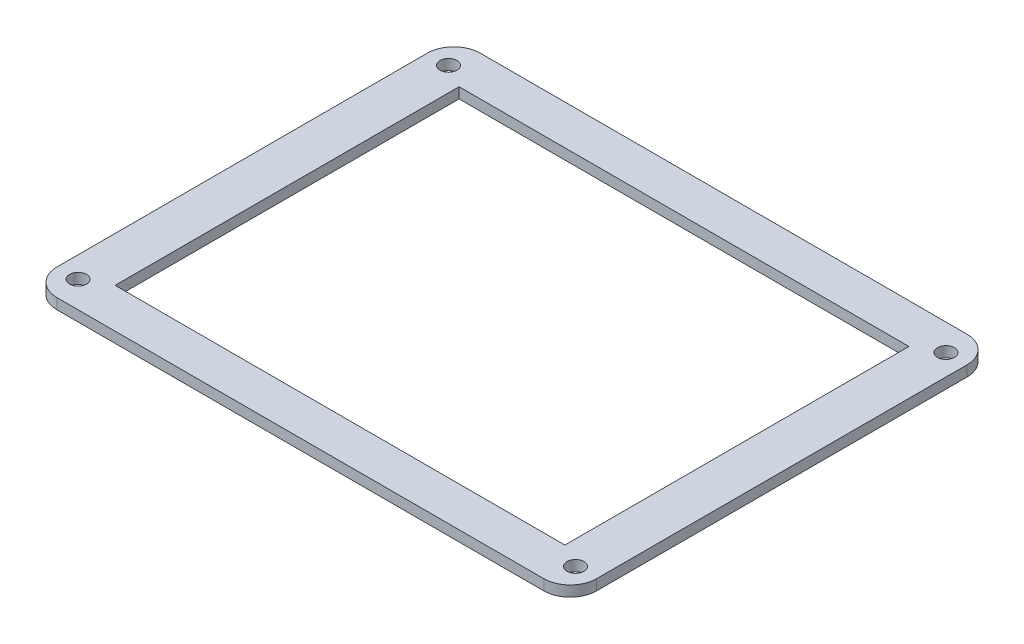
ISO-10303-21;
HEADER;
FILE_DESCRIPTION(('STEP AP214'),'2;1');
FILE_NAME('part.step','',(''),(''),'','','');
FILE_SCHEMA(('AUTOMOTIVE_DESIGN { 1 0 10303 214 1 1 1 1 }'));
ENDSEC;
DATA;
#1=APPLICATION_CONTEXT('core data for automotive mechanical design processes');
#2=APPLICATION_PROTOCOL_DEFINITION('international standard','automotive_design',2000,#1);
#3=PRODUCT_CONTEXT('',#1,'mechanical');
#4=PRODUCT('Part','Part','',(#3));
#5=PRODUCT_RELATED_PRODUCT_CATEGORY('part','',(#4));
#6=PRODUCT_DEFINITION_FORMATION('','',#4);
#7=PRODUCT_DEFINITION_CONTEXT('part definition',#1,'design');
#8=PRODUCT_DEFINITION('design','',#6,#7);
#9=PRODUCT_DEFINITION_SHAPE('','',#8);
#10=(LENGTH_UNIT() NAMED_UNIT(*) SI_UNIT(.MILLI.,.METRE.));
#11=(NAMED_UNIT(*) PLANE_ANGLE_UNIT() SI_UNIT($,.RADIAN.));
#12=(NAMED_UNIT(*) SI_UNIT($,.STERADIAN.) SOLID_ANGLE_UNIT());
#13=UNCERTAINTY_MEASURE_WITH_UNIT(LENGTH_MEASURE(1.E-05),#10,'distance_accuracy_value','');
#14=(GEOMETRIC_REPRESENTATION_CONTEXT(3) GLOBAL_UNCERTAINTY_ASSIGNED_CONTEXT((#13)) GLOBAL_UNIT_ASSIGNED_CONTEXT((#10,
#11,#12)) REPRESENTATION_CONTEXT('',''));
#15=CARTESIAN_POINT('',(0.,0.,0.));
#16=DIRECTION('',(0.,0.,1.));
#17=DIRECTION('',(1.,0.,0.));
#18=AXIS2_PLACEMENT_3D('',#15,#16,#17);
#19=CARTESIAN_POINT('',(0.,2.,0.));
#20=DIRECTION('',(0.,-1.,0.));
#21=DIRECTION('',(0.,0.,-1.));
#22=AXIS2_PLACEMENT_3D('',#19,#20,#21);
#23=PLANE('',#22);
#24=CARTESIAN_POINT('',(-47.,2.,-35.));
#25=DIRECTION('',(0.,-1.,0.));
#26=DIRECTION('',(0.,0.,-1.));
#27=AXIS2_PLACEMENT_3D('',#24,#25,#26);
#28=CIRCLE('',#27,1.6);
#29=CARTESIAN_POINT('',(-47.,2.,-36.6));
#30=VERTEX_POINT('',#29);
#31=EDGE_CURVE('E198',#30,#30,#28,.T.);
#32=ORIENTED_EDGE('',*,*,#31,.T.);
#33=EDGE_LOOP('',(#32));
#34=FACE_BOUND('',#33,.T.);
#35=CARTESIAN_POINT('',(47.,2.,-35.));
#36=DIRECTION('',(0.,-1.,0.));
#37=DIRECTION('',(0.,0.,-1.));
#38=AXIS2_PLACEMENT_3D('',#35,#36,#37);
#39=CIRCLE('',#38,1.6);
#40=CARTESIAN_POINT('',(47.,2.,-36.6));
#41=VERTEX_POINT('',#40);
#42=EDGE_CURVE('E302',#41,#41,#39,.T.);
#43=ORIENTED_EDGE('',*,*,#42,.T.);
#44=EDGE_LOOP('',(#43));
#45=FACE_BOUND('',#44,.T.);
#46=CARTESIAN_POINT('',(47.,2.,35.));
#47=DIRECTION('',(0.,-1.,0.));
#48=DIRECTION('',(0.,0.,-1.));
#49=AXIS2_PLACEMENT_3D('',#46,#47,#48);
#50=CIRCLE('',#49,1.6);
#51=CARTESIAN_POINT('',(47.,2.,33.4));
#52=VERTEX_POINT('',#51);
#53=EDGE_CURVE('E298',#52,#52,#50,.T.);
#54=ORIENTED_EDGE('',*,*,#53,.T.);
#55=EDGE_LOOP('',(#54));
#56=FACE_BOUND('',#55,.T.);
#57=CARTESIAN_POINT('',(-47.,2.,35.));
#58=DIRECTION('',(0.,-1.,0.));
#59=DIRECTION('',(0.,0.,-1.));
#60=AXIS2_PLACEMENT_3D('',#57,#58,#59);
#61=CIRCLE('',#60,1.6);
#62=CARTESIAN_POINT('',(-47.,2.,33.4));
#63=VERTEX_POINT('',#62);
#64=EDGE_CURVE('E294',#63,#63,#61,.T.);
#65=ORIENTED_EDGE('',*,*,#64,.T.);
#66=EDGE_LOOP('',(#65));
#67=FACE_BOUND('',#66,.T.);
#68=DIRECTION('',(1.,0.,0.));
#69=VECTOR('',#68,1.);
#70=CARTESIAN_POINT('',(-51.,2.,-40.));
#71=LINE('',#70,#69);
#72=CARTESIAN_POINT('',(-46.,2.,-40.));
#73=VERTEX_POINT('',#72);
#74=CARTESIAN_POINT('',(46.,2.,-40.));
#75=VERTEX_POINT('',#74);
#76=EDGE_CURVE('E222',#73,#75,#71,.T.);
#77=ORIENTED_EDGE('',*,*,#76,.F.);
#78=CARTESIAN_POINT('',(-46.,2.,-35.));
#79=DIRECTION('',(0.,-1.,0.));
#80=DIRECTION('',(0.,0.,-1.));
#81=AXIS2_PLACEMENT_3D('',#78,#79,#80);
#82=CIRCLE('',#81,5.);
#83=CARTESIAN_POINT('',(-51.,2.,-35.));
#84=VERTEX_POINT('',#83);
#85=EDGE_CURVE('E278',#73,#84,#82,.F.);
#86=ORIENTED_EDGE('',*,*,#85,.T.);
#87=DIRECTION('',(0.,0.,1.));
#88=VECTOR('',#87,1.);
#89=CARTESIAN_POINT('',(-51.,2.,-40.));
#90=LINE('',#89,#88);
#91=CARTESIAN_POINT('',(-51.,2.,35.));
#92=VERTEX_POINT('',#91);
#93=EDGE_CURVE('E226',#84,#92,#90,.T.);
#94=ORIENTED_EDGE('',*,*,#93,.T.);
#95=CARTESIAN_POINT('',(-46.,2.,35.));
#96=DIRECTION('',(0.,-1.,0.));
#97=DIRECTION('',(0.,0.,-1.));
#98=AXIS2_PLACEMENT_3D('',#95,#96,#97);
#99=CIRCLE('',#98,5.);
#100=CARTESIAN_POINT('',(-46.,2.,40.));
#101=VERTEX_POINT('',#100);
#102=EDGE_CURVE('E275',#92,#101,#99,.F.);
#103=ORIENTED_EDGE('',*,*,#102,.T.);
#104=DIRECTION('',(1.,0.,0.));
#105=VECTOR('',#104,1.);
#106=CARTESIAN_POINT('',(-51.,2.,40.));
#107=LINE('',#106,#105);
#108=CARTESIAN_POINT('',(46.,2.,40.));
#109=VERTEX_POINT('',#108);
#110=EDGE_CURVE('E215',#101,#109,#107,.T.);
#111=ORIENTED_EDGE('',*,*,#110,.T.);
#112=CARTESIAN_POINT('',(46.,2.,35.));
#113=DIRECTION('',(0.,-1.,0.));
#114=DIRECTION('',(0.,0.,-1.));
#115=AXIS2_PLACEMENT_3D('',#112,#113,#114);
#116=CIRCLE('',#115,5.);
#117=CARTESIAN_POINT('',(51.,2.,35.));
#118=VERTEX_POINT('',#117);
#119=EDGE_CURVE('E85',#109,#118,#116,.F.);
#120=ORIENTED_EDGE('',*,*,#119,.T.);
#121=DIRECTION('',(0.,0.,1.));
#122=VECTOR('',#121,1.);
#123=CARTESIAN_POINT('',(51.,2.,-40.));
#124=LINE('',#123,#122);
#125=CARTESIAN_POINT('',(51.,2.,-35.));
#126=VERTEX_POINT('',#125);
#127=EDGE_CURVE('E218',#126,#118,#124,.T.);
#128=ORIENTED_EDGE('',*,*,#127,.F.);
#129=CARTESIAN_POINT('',(46.,2.,-35.));
#130=DIRECTION('',(0.,-1.,0.));
#131=DIRECTION('',(0.,0.,-1.));
#132=AXIS2_PLACEMENT_3D('',#129,#130,#131);
#133=CIRCLE('',#132,5.);
#134=EDGE_CURVE('E270',#126,#75,#133,.F.);
#135=ORIENTED_EDGE('',*,*,#134,.T.);
#136=EDGE_LOOP('',(#77,#86,#94,#103,#111,#120,#128,#135));
#137=FACE_BOUND('',#136,.T.);
#138=DIRECTION('',(1.,0.,0.));
#139=VECTOR('',#138,1.);
#140=CARTESIAN_POINT('',(-42.5,2.,32.5));
#141=LINE('',#140,#139);
#142=CARTESIAN_POINT('',(-42.5,2.,32.5));
#143=VERTEX_POINT('',#142);
#144=CARTESIAN_POINT('',(42.5,2.,32.5));
#145=VERTEX_POINT('',#144);
#146=EDGE_CURVE('E160',#143,#145,#141,.T.);
#147=ORIENTED_EDGE('',*,*,#146,.F.);
#148=DIRECTION('',(0.,0.,1.));
#149=VECTOR('',#148,1.);
#150=CARTESIAN_POINT('',(-42.5,2.,-32.5));
#151=LINE('',#150,#149);
#152=CARTESIAN_POINT('',(-42.5,2.,-32.5));
#153=VERTEX_POINT('',#152);
#154=EDGE_CURVE('E189',#153,#143,#151,.T.);
#155=ORIENTED_EDGE('',*,*,#154,.F.);
#156=DIRECTION('',(1.,0.,0.));
#157=VECTOR('',#156,1.);
#158=CARTESIAN_POINT('',(-42.5,2.,-32.5));
#159=LINE('',#158,#157);
#160=CARTESIAN_POINT('',(42.5,2.,-32.5));
#161=VERTEX_POINT('',#160);
#162=EDGE_CURVE('E185',#153,#161,#159,.T.);
#163=ORIENTED_EDGE('',*,*,#162,.T.);
#164=DIRECTION('',(0.,0.,1.));
#165=VECTOR('',#164,1.);
#166=CARTESIAN_POINT('',(42.5,2.,-32.5));
#167=LINE('',#166,#165);
#168=EDGE_CURVE('E171',#161,#145,#167,.T.);
#169=ORIENTED_EDGE('',*,*,#168,.T.);
#170=EDGE_LOOP('',(#147,#155,#163,#169));
#171=FACE_BOUND('',#170,.T.);
#172=ADVANCED_FACE('F67',(#34,#45,#56,#67,#137,#171),#23,.F.);
#173=CARTESIAN_POINT('',(0.,0.,0.));
#174=DIRECTION('',(0.,-1.,0.));
#175=DIRECTION('',(0.,0.,-1.));
#176=AXIS2_PLACEMENT_3D('',#173,#174,#175);
#177=PLANE('',#176);
#178=CARTESIAN_POINT('',(-47.,0.,-35.));
#179=DIRECTION('',(0.,-1.,0.));
#180=DIRECTION('',(0.,0.,-1.));
#181=AXIS2_PLACEMENT_3D('',#178,#179,#180);
#182=CIRCLE('',#181,1.6);
#183=CARTESIAN_POINT('',(-47.,0.,-36.6));
#184=VERTEX_POINT('',#183);
#185=EDGE_CURVE('E71',#184,#184,#182,.T.);
#186=ORIENTED_EDGE('',*,*,#185,.F.);
#187=EDGE_LOOP('',(#186));
#188=FACE_BOUND('',#187,.T.);
#189=CARTESIAN_POINT('',(47.,0.,-35.));
#190=DIRECTION('',(0.,-1.,0.));
#191=DIRECTION('',(0.,0.,-1.));
#192=AXIS2_PLACEMENT_3D('',#189,#190,#191);
#193=CIRCLE('',#192,1.6);
#194=CARTESIAN_POINT('',(47.,0.,-36.6));
#195=VERTEX_POINT('',#194);
#196=EDGE_CURVE('E299',#195,#195,#193,.T.);
#197=ORIENTED_EDGE('',*,*,#196,.F.);
#198=EDGE_LOOP('',(#197));
#199=FACE_BOUND('',#198,.T.);
#200=CARTESIAN_POINT('',(47.,0.,35.));
#201=DIRECTION('',(0.,-1.,0.));
#202=DIRECTION('',(0.,0.,-1.));
#203=AXIS2_PLACEMENT_3D('',#200,#201,#202);
#204=CIRCLE('',#203,1.6);
#205=CARTESIAN_POINT('',(47.,0.,33.4));
#206=VERTEX_POINT('',#205);
#207=EDGE_CURVE('E295',#206,#206,#204,.T.);
#208=ORIENTED_EDGE('',*,*,#207,.F.);
#209=EDGE_LOOP('',(#208));
#210=FACE_BOUND('',#209,.T.);
#211=CARTESIAN_POINT('',(-47.,0.,35.));
#212=DIRECTION('',(0.,-1.,0.));
#213=DIRECTION('',(0.,0.,-1.));
#214=AXIS2_PLACEMENT_3D('',#211,#212,#213);
#215=CIRCLE('',#214,1.6);
#216=CARTESIAN_POINT('',(-47.,0.,33.4));
#217=VERTEX_POINT('',#216);
#218=EDGE_CURVE('E290',#217,#217,#215,.T.);
#219=ORIENTED_EDGE('',*,*,#218,.F.);
#220=EDGE_LOOP('',(#219));
#221=FACE_BOUND('',#220,.T.);
#222=DIRECTION('',(0.,0.,1.));
#223=VECTOR('',#222,1.);
#224=CARTESIAN_POINT('',(-51.,0.,-40.));
#225=LINE('',#224,#223);
#226=CARTESIAN_POINT('',(-51.,0.,-35.));
#227=VERTEX_POINT('',#226);
#228=CARTESIAN_POINT('',(-51.,0.,35.));
#229=VERTEX_POINT('',#228);
#230=EDGE_CURVE('E219',#227,#229,#225,.T.);
#231=ORIENTED_EDGE('',*,*,#230,.F.);
#232=CARTESIAN_POINT('',(-46.,0.,-35.));
#233=DIRECTION('',(0.,-1.,0.));
#234=DIRECTION('',(0.,0.,-1.));
#235=AXIS2_PLACEMENT_3D('',#232,#233,#234);
#236=CIRCLE('',#235,5.);
#237=CARTESIAN_POINT('',(-46.,0.,-40.));
#238=VERTEX_POINT('',#237);
#239=EDGE_CURVE('E260',#227,#238,#236,.T.);
#240=ORIENTED_EDGE('',*,*,#239,.T.);
#241=DIRECTION('',(1.,0.,0.));
#242=VECTOR('',#241,1.);
#243=CARTESIAN_POINT('',(-51.,0.,-40.));
#244=LINE('',#243,#242);
#245=CARTESIAN_POINT('',(46.,0.,-40.));
#246=VERTEX_POINT('',#245);
#247=EDGE_CURVE('E238',#238,#246,#244,.T.);
#248=ORIENTED_EDGE('',*,*,#247,.T.);
#249=CARTESIAN_POINT('',(46.,0.,-35.));
#250=DIRECTION('',(0.,-1.,0.));
#251=DIRECTION('',(0.,0.,-1.));
#252=AXIS2_PLACEMENT_3D('',#249,#250,#251);
#253=CIRCLE('',#252,5.);
#254=CARTESIAN_POINT('',(51.,0.,-35.));
#255=VERTEX_POINT('',#254);
#256=EDGE_CURVE('E251',#246,#255,#253,.T.);
#257=ORIENTED_EDGE('',*,*,#256,.T.);
#258=DIRECTION('',(0.,0.,1.));
#259=VECTOR('',#258,1.);
#260=CARTESIAN_POINT('',(51.,0.,-40.));
#261=LINE('',#260,#259);
#262=CARTESIAN_POINT('',(51.,0.,35.));
#263=VERTEX_POINT('',#262);
#264=EDGE_CURVE('E234',#255,#263,#261,.T.);
#265=ORIENTED_EDGE('',*,*,#264,.T.);
#266=CARTESIAN_POINT('',(46.,0.,35.));
#267=DIRECTION('',(0.,-1.,0.));
#268=DIRECTION('',(0.,0.,-1.));
#269=AXIS2_PLACEMENT_3D('',#266,#267,#268);
#270=CIRCLE('',#269,5.);
#271=CARTESIAN_POINT('',(46.,0.,40.));
#272=VERTEX_POINT('',#271);
#273=EDGE_CURVE('E254',#263,#272,#270,.T.);
#274=ORIENTED_EDGE('',*,*,#273,.T.);
#275=DIRECTION('',(1.,0.,0.));
#276=VECTOR('',#275,1.);
#277=CARTESIAN_POINT('',(-51.,0.,40.));
#278=LINE('',#277,#276);
#279=CARTESIAN_POINT('',(-46.,0.,40.));
#280=VERTEX_POINT('',#279);
#281=EDGE_CURVE('E182',#280,#272,#278,.T.);
#282=ORIENTED_EDGE('',*,*,#281,.F.);
#283=CARTESIAN_POINT('',(-46.,0.,35.));
#284=DIRECTION('',(0.,-1.,0.));
#285=DIRECTION('',(0.,0.,-1.));
#286=AXIS2_PLACEMENT_3D('',#283,#284,#285);
#287=CIRCLE('',#286,5.);
#288=EDGE_CURVE('E257',#280,#229,#287,.T.);
#289=ORIENTED_EDGE('',*,*,#288,.T.);
#290=EDGE_LOOP('',(#231,#240,#248,#257,#265,#274,#282,#289));
#291=FACE_BOUND('',#290,.T.);
#292=DIRECTION('',(0.,0.,1.));
#293=VECTOR('',#292,1.);
#294=CARTESIAN_POINT('',(-42.5,0.,-32.5));
#295=LINE('',#294,#293);
#296=CARTESIAN_POINT('',(-42.5,0.,-32.5));
#297=VERTEX_POINT('',#296);
#298=CARTESIAN_POINT('',(-42.5,0.,32.5));
#299=VERTEX_POINT('',#298);
#300=EDGE_CURVE('E172',#297,#299,#295,.T.);
#301=ORIENTED_EDGE('',*,*,#300,.T.);
#302=DIRECTION('',(1.,0.,0.));
#303=VECTOR('',#302,1.);
#304=CARTESIAN_POINT('',(-42.5,0.,32.5));
#305=LINE('',#304,#303);
#306=CARTESIAN_POINT('',(42.5,0.,32.5));
#307=VERTEX_POINT('',#306);
#308=EDGE_CURVE('E195',#299,#307,#305,.T.);
#309=ORIENTED_EDGE('',*,*,#308,.T.);
#310=DIRECTION('',(0.,0.,1.));
#311=VECTOR('',#310,1.);
#312=CARTESIAN_POINT('',(42.5,0.,-32.5));
#313=LINE('',#312,#311);
#314=CARTESIAN_POINT('',(42.5,0.,-32.5));
#315=VERTEX_POINT('',#314);
#316=EDGE_CURVE('E179',#315,#307,#313,.T.);
#317=ORIENTED_EDGE('',*,*,#316,.F.);
#318=DIRECTION('',(1.,0.,0.));
#319=VECTOR('',#318,1.);
#320=CARTESIAN_POINT('',(-42.5,0.,-32.5));
#321=LINE('',#320,#319);
#322=EDGE_CURVE('E201',#297,#315,#321,.T.);
#323=ORIENTED_EDGE('',*,*,#322,.F.);
#324=EDGE_LOOP('',(#301,#309,#317,#323));
#325=FACE_BOUND('',#324,.T.);
#326=ADVANCED_FACE('F325',(#188,#199,#210,#221,#291,#325),#177,.T.);
#327=CARTESIAN_POINT('',(-51.,2.,40.));
#328=DIRECTION('',(0.,0.,-1.));
#329=DIRECTION('',(-1.,0.,0.));
#330=AXIS2_PLACEMENT_3D('',#327,#328,#329);
#331=PLANE('',#330);
#332=ORIENTED_EDGE('',*,*,#110,.F.);
#333=DIRECTION('',(0.,-1.,0.));
#334=VECTOR('',#333,1.);
#335=CARTESIAN_POINT('',(-46.,2.,40.));
#336=LINE('',#335,#334);
#337=EDGE_CURVE('E284',#101,#280,#336,.T.);
#338=ORIENTED_EDGE('',*,*,#337,.T.);
#339=ORIENTED_EDGE('',*,*,#281,.T.);
#340=DIRECTION('',(0.,-1.,0.));
#341=VECTOR('',#340,1.);
#342=CARTESIAN_POINT('',(46.,2.,40.));
#343=LINE('',#342,#341);
#344=EDGE_CURVE('E281',#272,#109,#343,.F.);
#345=ORIENTED_EDGE('',*,*,#344,.T.);
#346=EDGE_LOOP('',(#332,#338,#339,#345));
#347=FACE_BOUND('',#346,.T.);
#348=ADVANCED_FACE('F328',(#347),#331,.F.);
#349=CARTESIAN_POINT('',(51.,2.,-40.));
#350=DIRECTION('',(1.,0.,0.));
#351=DIRECTION('',(0.,0.,-1.));
#352=AXIS2_PLACEMENT_3D('',#349,#350,#351);
#353=PLANE('',#352);
#354=ORIENTED_EDGE('',*,*,#127,.T.);
#355=DIRECTION('',(0.,-1.,0.));
#356=VECTOR('',#355,1.);
#357=CARTESIAN_POINT('',(51.,0.,35.));
#358=LINE('',#357,#356);
#359=EDGE_CURVE('E12',#118,#263,#358,.T.);
#360=ORIENTED_EDGE('',*,*,#359,.T.);
#361=ORIENTED_EDGE('',*,*,#264,.F.);
#362=DIRECTION('',(0.,-1.,0.));
#363=VECTOR('',#362,1.);
#364=CARTESIAN_POINT('',(51.,2.,-35.));
#365=LINE('',#364,#363);
#366=EDGE_CURVE('E77',#255,#126,#365,.F.);
#367=ORIENTED_EDGE('',*,*,#366,.T.);
#368=EDGE_LOOP('',(#354,#360,#361,#367));
#369=FACE_BOUND('',#368,.T.);
#370=ADVANCED_FACE('F367',(#369),#353,.T.);
#371=CARTESIAN_POINT('',(-51.,2.,-40.));
#372=DIRECTION('',(0.,0.,-1.));
#373=DIRECTION('',(-1.,0.,0.));
#374=AXIS2_PLACEMENT_3D('',#371,#372,#373);
#375=PLANE('',#374);
#376=ORIENTED_EDGE('',*,*,#247,.F.);
#377=DIRECTION('',(0.,-1.,0.));
#378=VECTOR('',#377,1.);
#379=CARTESIAN_POINT('',(-46.,2.,-40.));
#380=LINE('',#379,#378);
#381=EDGE_CURVE('E267',#238,#73,#380,.F.);
#382=ORIENTED_EDGE('',*,*,#381,.T.);
#383=ORIENTED_EDGE('',*,*,#76,.T.);
#384=DIRECTION('',(0.,-1.,0.));
#385=VECTOR('',#384,1.);
#386=CARTESIAN_POINT('',(46.,2.,-40.));
#387=LINE('',#386,#385);
#388=EDGE_CURVE('E263',#75,#246,#387,.T.);
#389=ORIENTED_EDGE('',*,*,#388,.T.);
#390=EDGE_LOOP('',(#376,#382,#383,#389));
#391=FACE_BOUND('',#390,.T.);
#392=ADVANCED_FACE('F363',(#391),#375,.T.);
#393=CARTESIAN_POINT('',(-51.,2.,-40.));
#394=DIRECTION('',(1.,0.,0.));
#395=DIRECTION('',(0.,0.,-1.));
#396=AXIS2_PLACEMENT_3D('',#393,#394,#395);
#397=PLANE('',#396);
#398=ORIENTED_EDGE('',*,*,#93,.F.);
#399=DIRECTION('',(0.,-1.,0.));
#400=VECTOR('',#399,1.);
#401=CARTESIAN_POINT('',(-51.,0.,-35.));
#402=LINE('',#401,#400);
#403=EDGE_CURVE('E247',#84,#227,#402,.T.);
#404=ORIENTED_EDGE('',*,*,#403,.T.);
#405=ORIENTED_EDGE('',*,*,#230,.T.);
#406=DIRECTION('',(0.,-1.,0.));
#407=VECTOR('',#406,1.);
#408=CARTESIAN_POINT('',(-51.,2.,35.));
#409=LINE('',#408,#407);
#410=EDGE_CURVE('E230',#229,#92,#409,.F.);
#411=ORIENTED_EDGE('',*,*,#410,.T.);
#412=EDGE_LOOP('',(#398,#404,#405,#411));
#413=FACE_BOUND('',#412,.T.);
#414=ADVANCED_FACE('F360',(#413),#397,.F.);
#415=CARTESIAN_POINT('',(-42.5,2.,32.5));
#416=DIRECTION('',(0.,0.,-1.));
#417=DIRECTION('',(-1.,0.,0.));
#418=AXIS2_PLACEMENT_3D('',#415,#416,#417);
#419=PLANE('',#418);
#420=ORIENTED_EDGE('',*,*,#308,.F.);
#421=DIRECTION('',(0.,-1.,0.));
#422=VECTOR('',#421,1.);
#423=CARTESIAN_POINT('',(-42.5,2.,32.5));
#424=LINE('',#423,#422);
#425=EDGE_CURVE('E166',#143,#299,#424,.T.);
#426=ORIENTED_EDGE('',*,*,#425,.F.);
#427=ORIENTED_EDGE('',*,*,#146,.T.);
#428=DIRECTION('',(0.,-1.,0.));
#429=VECTOR('',#428,1.);
#430=CARTESIAN_POINT('',(42.5,2.,32.5));
#431=LINE('',#430,#429);
#432=EDGE_CURVE('E163',#145,#307,#431,.T.);
#433=ORIENTED_EDGE('',*,*,#432,.T.);
#434=EDGE_LOOP('',(#420,#426,#427,#433));
#435=FACE_BOUND('',#434,.T.);
#436=ADVANCED_FACE('F162',(#435),#419,.T.);
#437=CARTESIAN_POINT('',(42.5,2.,-32.5));
#438=DIRECTION('',(1.,0.,0.));
#439=DIRECTION('',(0.,0.,-1.));
#440=AXIS2_PLACEMENT_3D('',#437,#438,#439);
#441=PLANE('',#440);
#442=ORIENTED_EDGE('',*,*,#316,.T.);
#443=ORIENTED_EDGE('',*,*,#432,.F.);
#444=ORIENTED_EDGE('',*,*,#168,.F.);
#445=DIRECTION('',(0.,-1.,0.));
#446=VECTOR('',#445,1.);
#447=CARTESIAN_POINT('',(42.5,2.,-32.5));
#448=LINE('',#447,#446);
#449=EDGE_CURVE('E183',#161,#315,#448,.T.);
#450=ORIENTED_EDGE('',*,*,#449,.T.);
#451=EDGE_LOOP('',(#442,#443,#444,#450));
#452=FACE_BOUND('',#451,.T.);
#453=ADVANCED_FACE('F176',(#452),#441,.F.);
#454=CARTESIAN_POINT('',(-42.5,2.,-32.5));
#455=DIRECTION('',(0.,0.,-1.));
#456=DIRECTION('',(-1.,0.,0.));
#457=AXIS2_PLACEMENT_3D('',#454,#455,#456);
#458=PLANE('',#457);
#459=ORIENTED_EDGE('',*,*,#322,.T.);
#460=ORIENTED_EDGE('',*,*,#449,.F.);
#461=ORIENTED_EDGE('',*,*,#162,.F.);
#462=DIRECTION('',(0.,-1.,0.));
#463=VECTOR('',#462,1.);
#464=CARTESIAN_POINT('',(-42.5,2.,-32.5));
#465=LINE('',#464,#463);
#466=EDGE_CURVE('E210',#153,#297,#465,.T.);
#467=ORIENTED_EDGE('',*,*,#466,.T.);
#468=EDGE_LOOP('',(#459,#460,#461,#467));
#469=FACE_BOUND('',#468,.T.);
#470=ADVANCED_FACE('F343',(#469),#458,.F.);
#471=CARTESIAN_POINT('',(-42.5,2.,-32.5));
#472=DIRECTION('',(1.,0.,0.));
#473=DIRECTION('',(0.,0.,-1.));
#474=AXIS2_PLACEMENT_3D('',#471,#472,#473);
#475=PLANE('',#474);
#476=ORIENTED_EDGE('',*,*,#300,.F.);
#477=ORIENTED_EDGE('',*,*,#466,.F.);
#478=ORIENTED_EDGE('',*,*,#154,.T.);
#479=ORIENTED_EDGE('',*,*,#425,.T.);
#480=EDGE_LOOP('',(#476,#477,#478,#479));
#481=FACE_BOUND('',#480,.T.);
#482=ADVANCED_FACE('F341',(#481),#475,.T.);
#483=CARTESIAN_POINT('',(-46.,2.,-35.));
#484=DIRECTION('',(0.,1.,0.));
#485=DIRECTION('',(0.,0.,1.));
#486=AXIS2_PLACEMENT_3D('',#483,#484,#485);
#487=CYLINDRICAL_SURFACE('',#486,5.);
#488=ORIENTED_EDGE('',*,*,#85,.F.);
#489=ORIENTED_EDGE('',*,*,#381,.F.);
#490=ORIENTED_EDGE('',*,*,#239,.F.);
#491=ORIENTED_EDGE('',*,*,#403,.F.);
#492=EDGE_LOOP('',(#488,#489,#490,#491));
#493=FACE_BOUND('',#492,.T.);
#494=ADVANCED_FACE('F350',(#493),#487,.T.);
#495=CARTESIAN_POINT('',(-46.,2.,35.));
#496=DIRECTION('',(0.,-1.,0.));
#497=DIRECTION('',(0.,0.,-1.));
#498=AXIS2_PLACEMENT_3D('',#495,#496,#497);
#499=CYLINDRICAL_SURFACE('',#498,5.);
#500=ORIENTED_EDGE('',*,*,#102,.F.);
#501=ORIENTED_EDGE('',*,*,#410,.F.);
#502=ORIENTED_EDGE('',*,*,#288,.F.);
#503=ORIENTED_EDGE('',*,*,#337,.F.);
#504=EDGE_LOOP('',(#500,#501,#502,#503));
#505=FACE_BOUND('',#504,.T.);
#506=ADVANCED_FACE('F376',(#505),#499,.T.);
#507=CARTESIAN_POINT('',(46.,2.,35.));
#508=DIRECTION('',(0.,1.,0.));
#509=DIRECTION('',(0.,0.,1.));
#510=AXIS2_PLACEMENT_3D('',#507,#508,#509);
#511=CYLINDRICAL_SURFACE('',#510,5.);
#512=ORIENTED_EDGE('',*,*,#119,.F.);
#513=ORIENTED_EDGE('',*,*,#344,.F.);
#514=ORIENTED_EDGE('',*,*,#273,.F.);
#515=ORIENTED_EDGE('',*,*,#359,.F.);
#516=EDGE_LOOP('',(#512,#513,#514,#515));
#517=FACE_BOUND('',#516,.T.);
#518=ADVANCED_FACE('F379',(#517),#511,.T.);
#519=CARTESIAN_POINT('',(46.,2.,-35.));
#520=DIRECTION('',(0.,-1.,0.));
#521=DIRECTION('',(0.,0.,-1.));
#522=AXIS2_PLACEMENT_3D('',#519,#520,#521);
#523=CYLINDRICAL_SURFACE('',#522,5.);
#524=ORIENTED_EDGE('',*,*,#134,.F.);
#525=ORIENTED_EDGE('',*,*,#366,.F.);
#526=ORIENTED_EDGE('',*,*,#256,.F.);
#527=ORIENTED_EDGE('',*,*,#388,.F.);
#528=EDGE_LOOP('',(#524,#525,#526,#527));
#529=FACE_BOUND('',#528,.T.);
#530=ADVANCED_FACE('F69',(#529),#523,.T.);
#531=CARTESIAN_POINT('',(-47.,-62.5,35.));
#532=DIRECTION('',(0.,1.,0.));
#533=DIRECTION('',(0.,0.,1.));
#534=AXIS2_PLACEMENT_3D('',#531,#532,#533);
#535=CYLINDRICAL_SURFACE('',#534,1.6);
#536=ORIENTED_EDGE('',*,*,#218,.T.);
#537=EDGE_LOOP('',(#536));
#538=FACE_BOUND('',#537,.T.);
#539=ORIENTED_EDGE('',*,*,#64,.F.);
#540=EDGE_LOOP('',(#539));
#541=FACE_BOUND('',#540,.T.);
#542=ADVANCED_FACE('F386',(#538,#541),#535,.F.);
#543=CARTESIAN_POINT('',(47.,-62.5,35.));
#544=DIRECTION('',(0.,1.,0.));
#545=DIRECTION('',(0.,0.,1.));
#546=AXIS2_PLACEMENT_3D('',#543,#544,#545);
#547=CYLINDRICAL_SURFACE('',#546,1.6);
#548=ORIENTED_EDGE('',*,*,#207,.T.);
#549=EDGE_LOOP('',(#548));
#550=FACE_BOUND('',#549,.T.);
#551=ORIENTED_EDGE('',*,*,#53,.F.);
#552=EDGE_LOOP('',(#551));
#553=FACE_BOUND('',#552,.T.);
#554=ADVANCED_FACE('F406',(#550,#553),#547,.F.);
#555=CARTESIAN_POINT('',(47.,-62.5,-35.));
#556=DIRECTION('',(0.,1.,0.));
#557=DIRECTION('',(0.,0.,1.));
#558=AXIS2_PLACEMENT_3D('',#555,#556,#557);
#559=CYLINDRICAL_SURFACE('',#558,1.6);
#560=ORIENTED_EDGE('',*,*,#196,.T.);
#561=EDGE_LOOP('',(#560));
#562=FACE_BOUND('',#561,.T.);
#563=ORIENTED_EDGE('',*,*,#42,.F.);
#564=EDGE_LOOP('',(#563));
#565=FACE_BOUND('',#564,.T.);
#566=ADVANCED_FACE('F412',(#562,#565),#559,.F.);
#567=CARTESIAN_POINT('',(-47.,-62.5,-35.));
#568=DIRECTION('',(0.,1.,0.));
#569=DIRECTION('',(0.,0.,1.));
#570=AXIS2_PLACEMENT_3D('',#567,#568,#569);
#571=CYLINDRICAL_SURFACE('',#570,1.6);
#572=ORIENTED_EDGE('',*,*,#185,.T.);
#573=EDGE_LOOP('',(#572));
#574=FACE_BOUND('',#573,.T.);
#575=ORIENTED_EDGE('',*,*,#31,.F.);
#576=EDGE_LOOP('',(#575));
#577=FACE_BOUND('',#576,.T.);
#578=ADVANCED_FACE('F322',(#574,#577),#571,.F.);
#579=CLOSED_SHELL('',(#172,#326,#348,#370,#392,#414,#436,#453,#470,#482,#494,#506,#518,#530,
#542,#554,#566,#578));
#580=MANIFOLD_SOLID_BREP('B2',#579);
#581=ADVANCED_BREP_SHAPE_REPRESENTATION('',(#18,#580),#14);
#582=SHAPE_DEFINITION_REPRESENTATION(#9,#581);
ENDSEC;
END-ISO-10303-21;
